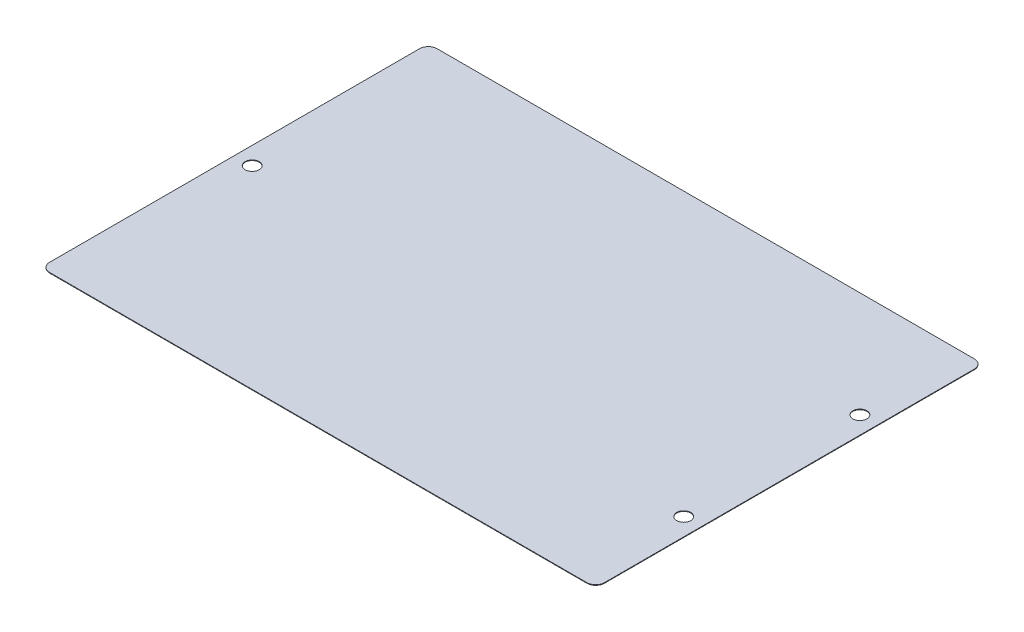
ISO-10303-21;
HEADER;
FILE_DESCRIPTION(('STEP AP214'),'2;1');
FILE_NAME('part.step','',(''),(''),'','','');
FILE_SCHEMA(('AUTOMOTIVE_DESIGN { 1 0 10303 214 1 1 1 1 }'));
ENDSEC;
DATA;
#1=APPLICATION_CONTEXT('core data for automotive mechanical design processes');
#2=APPLICATION_PROTOCOL_DEFINITION('international standard','automotive_design',2000,#1);
#3=PRODUCT_CONTEXT('',#1,'mechanical');
#4=PRODUCT('Part','Part','',(#3));
#5=PRODUCT_RELATED_PRODUCT_CATEGORY('part','',(#4));
#6=PRODUCT_DEFINITION_FORMATION('','',#4);
#7=PRODUCT_DEFINITION_CONTEXT('part definition',#1,'design');
#8=PRODUCT_DEFINITION('design','',#6,#7);
#9=PRODUCT_DEFINITION_SHAPE('','',#8);
#10=(LENGTH_UNIT() NAMED_UNIT(*) SI_UNIT(.MILLI.,.METRE.));
#11=(NAMED_UNIT(*) PLANE_ANGLE_UNIT() SI_UNIT($,.RADIAN.));
#12=(NAMED_UNIT(*) SI_UNIT($,.STERADIAN.) SOLID_ANGLE_UNIT());
#13=UNCERTAINTY_MEASURE_WITH_UNIT(LENGTH_MEASURE(1.E-05),#10,'distance_accuracy_value','');
#14=(GEOMETRIC_REPRESENTATION_CONTEXT(3) GLOBAL_UNCERTAINTY_ASSIGNED_CONTEXT((#13)) GLOBAL_UNIT_ASSIGNED_CONTEXT((#10,
#11,#12)) REPRESENTATION_CONTEXT('',''));
#15=CARTESIAN_POINT('',(0.,0.,0.));
#16=DIRECTION('',(0.,0.,1.));
#17=DIRECTION('',(1.,0.,0.));
#18=AXIS2_PLACEMENT_3D('',#15,#16,#17);
#19=CARTESIAN_POINT('',(0.,0.2,0.));
#20=DIRECTION('',(0.,1.,0.));
#21=DIRECTION('',(0.,0.,1.));
#22=AXIS2_PLACEMENT_3D('',#19,#20,#21);
#23=PLANE('',#22);
#24=CARTESIAN_POINT('',(183.,0.2,-36.));
#25=DIRECTION('',(0.,1.,0.));
#26=DIRECTION('',(0.,0.,1.));
#27=AXIS2_PLACEMENT_3D('',#24,#25,#26);
#28=CIRCLE('',#27,2.4);
#29=CARTESIAN_POINT('',(183.,0.2,-33.6));
#30=VERTEX_POINT('',#29);
#31=EDGE_CURVE('E180',#30,#30,#28,.T.);
#32=ORIENTED_EDGE('',*,*,#31,.F.);
#33=EDGE_LOOP('',(#32));
#34=FACE_BOUND('',#33,.T.);
#35=DIRECTION('',(-1.,0.,0.));
#36=VECTOR('',#35,1.);
#37=CARTESIAN_POINT('',(0.,0.2,-132.));
#38=LINE('',#37,#36);
#39=CARTESIAN_POINT('',(186.,0.2,-132.));
#40=VERTEX_POINT('',#39);
#41=CARTESIAN_POINT('',(3.,0.2,-132.));
#42=VERTEX_POINT('',#41);
#43=EDGE_CURVE('E135',#40,#42,#38,.T.);
#44=ORIENTED_EDGE('',*,*,#43,.T.);
#45=CARTESIAN_POINT('',(3.,0.2,-129.));
#46=DIRECTION('',(0.,1.,0.));
#47=DIRECTION('',(0.,0.,1.));
#48=AXIS2_PLACEMENT_3D('',#45,#46,#47);
#49=CIRCLE('',#48,3.);
#50=CARTESIAN_POINT('',(0.,0.2,-129.));
#51=VERTEX_POINT('',#50);
#52=EDGE_CURVE('E154',#42,#51,#49,.T.);
#53=ORIENTED_EDGE('',*,*,#52,.T.);
#54=DIRECTION('',(0.,0.,1.));
#55=VECTOR('',#54,1.);
#56=CARTESIAN_POINT('',(0.,0.2,-132.));
#57=LINE('',#56,#55);
#58=CARTESIAN_POINT('',(0.,0.2,-3.));
#59=VERTEX_POINT('',#58);
#60=EDGE_CURVE('E118',#51,#59,#57,.T.);
#61=ORIENTED_EDGE('',*,*,#60,.T.);
#62=CARTESIAN_POINT('',(3.,0.2,-3.));
#63=DIRECTION('',(0.,1.,0.));
#64=DIRECTION('',(0.,0.,1.));
#65=AXIS2_PLACEMENT_3D('',#62,#63,#64);
#66=CIRCLE('',#65,3.);
#67=CARTESIAN_POINT('',(3.,0.2,0.));
#68=VERTEX_POINT('',#67);
#69=EDGE_CURVE('E152',#59,#68,#66,.T.);
#70=ORIENTED_EDGE('',*,*,#69,.T.);
#71=DIRECTION('',(1.,0.,0.));
#72=VECTOR('',#71,1.);
#73=CARTESIAN_POINT('',(0.,0.2,0.));
#74=LINE('',#73,#72);
#75=CARTESIAN_POINT('',(186.,0.2,0.));
#76=VERTEX_POINT('',#75);
#77=EDGE_CURVE('E165',#68,#76,#74,.T.);
#78=ORIENTED_EDGE('',*,*,#77,.T.);
#79=CARTESIAN_POINT('',(186.,0.2,-3.));
#80=DIRECTION('',(0.,1.,0.));
#81=DIRECTION('',(0.,0.,1.));
#82=AXIS2_PLACEMENT_3D('',#79,#80,#81);
#83=CIRCLE('',#82,3.);
#84=CARTESIAN_POINT('',(189.,0.2,-3.));
#85=VERTEX_POINT('',#84);
#86=EDGE_CURVE('E53',#76,#85,#83,.T.);
#87=ORIENTED_EDGE('',*,*,#86,.T.);
#88=DIRECTION('',(0.,0.,-1.));
#89=VECTOR('',#88,1.);
#90=CARTESIAN_POINT('',(189.,0.2,-132.));
#91=LINE('',#90,#89);
#92=CARTESIAN_POINT('',(189.,0.2,-129.));
#93=VERTEX_POINT('',#92);
#94=EDGE_CURVE('E173',#85,#93,#91,.T.);
#95=ORIENTED_EDGE('',*,*,#94,.T.);
#96=CARTESIAN_POINT('',(186.,0.2,-129.));
#97=DIRECTION('',(0.,1.,0.));
#98=DIRECTION('',(0.,0.,1.));
#99=AXIS2_PLACEMENT_3D('',#96,#97,#98);
#100=CIRCLE('',#99,3.);
#101=EDGE_CURVE('E149',#93,#40,#100,.T.);
#102=ORIENTED_EDGE('',*,*,#101,.T.);
#103=EDGE_LOOP('',(#44,#53,#61,#70,#78,#87,#95,#102));
#104=FACE_BOUND('',#103,.T.);
#105=CARTESIAN_POINT('',(6.00000000000001,0.2,-66.));
#106=DIRECTION('',(0.,1.,0.));
#107=DIRECTION('',(0.,0.,1.));
#108=AXIS2_PLACEMENT_3D('',#105,#106,#107);
#109=CIRCLE('',#108,2.4);
#110=CARTESIAN_POINT('',(6.00000000000001,0.2,-63.6));
#111=VERTEX_POINT('',#110);
#112=EDGE_CURVE('E126',#111,#111,#109,.T.);
#113=ORIENTED_EDGE('',*,*,#112,.F.);
#114=EDGE_LOOP('',(#113));
#115=FACE_BOUND('',#114,.T.);
#116=CARTESIAN_POINT('',(183.,0.2,-96.));
#117=DIRECTION('',(0.,1.,0.));
#118=DIRECTION('',(0.,0.,1.));
#119=AXIS2_PLACEMENT_3D('',#116,#117,#118);
#120=CIRCLE('',#119,2.4);
#121=CARTESIAN_POINT('',(183.,0.2,-93.6));
#122=VERTEX_POINT('',#121);
#123=EDGE_CURVE('E185',#122,#122,#120,.T.);
#124=ORIENTED_EDGE('',*,*,#123,.F.);
#125=EDGE_LOOP('',(#124));
#126=FACE_BOUND('',#125,.T.);
#127=ADVANCED_FACE('F32',(#34,#104,#115,#126),#23,.T.);
#128=CARTESIAN_POINT('',(0.,0.,0.));
#129=DIRECTION('',(0.,1.,0.));
#130=DIRECTION('',(0.,0.,1.));
#131=AXIS2_PLACEMENT_3D('',#128,#129,#130);
#132=PLANE('',#131);
#133=CARTESIAN_POINT('',(183.,0.,-36.));
#134=DIRECTION('',(0.,1.,0.));
#135=DIRECTION('',(0.,0.,1.));
#136=AXIS2_PLACEMENT_3D('',#133,#134,#135);
#137=CIRCLE('',#136,2.4);
#138=CARTESIAN_POINT('',(183.,0.,-33.6));
#139=VERTEX_POINT('',#138);
#140=EDGE_CURVE('E182',#139,#139,#137,.T.);
#141=ORIENTED_EDGE('',*,*,#140,.T.);
#142=EDGE_LOOP('',(#141));
#143=FACE_BOUND('',#142,.T.);
#144=DIRECTION('',(0.,0.,1.));
#145=VECTOR('',#144,1.);
#146=CARTESIAN_POINT('',(0.,0.,-132.));
#147=LINE('',#146,#145);
#148=CARTESIAN_POINT('',(0.,0.,-129.));
#149=VERTEX_POINT('',#148);
#150=CARTESIAN_POINT('',(0.,0.,-3.));
#151=VERTEX_POINT('',#150);
#152=EDGE_CURVE('E115',#149,#151,#147,.T.);
#153=ORIENTED_EDGE('',*,*,#152,.F.);
#154=CARTESIAN_POINT('',(3.,0.,-129.));
#155=DIRECTION('',(0.,1.,0.));
#156=DIRECTION('',(0.,0.,1.));
#157=AXIS2_PLACEMENT_3D('',#154,#155,#156);
#158=CIRCLE('',#157,3.);
#159=CARTESIAN_POINT('',(3.,0.,-132.));
#160=VERTEX_POINT('',#159);
#161=EDGE_CURVE('E98',#149,#160,#158,.F.);
#162=ORIENTED_EDGE('',*,*,#161,.T.);
#163=DIRECTION('',(-1.,0.,0.));
#164=VECTOR('',#163,1.);
#165=CARTESIAN_POINT('',(0.,0.,-132.));
#166=LINE('',#165,#164);
#167=CARTESIAN_POINT('',(186.,0.,-132.));
#168=VERTEX_POINT('',#167);
#169=EDGE_CURVE('E139',#168,#160,#166,.T.);
#170=ORIENTED_EDGE('',*,*,#169,.F.);
#171=CARTESIAN_POINT('',(186.,0.,-129.));
#172=DIRECTION('',(0.,1.,0.));
#173=DIRECTION('',(0.,0.,1.));
#174=AXIS2_PLACEMENT_3D('',#171,#172,#173);
#175=CIRCLE('',#174,3.);
#176=CARTESIAN_POINT('',(189.,0.,-129.));
#177=VERTEX_POINT('',#176);
#178=EDGE_CURVE('E119',#168,#177,#175,.F.);
#179=ORIENTED_EDGE('',*,*,#178,.T.);
#180=DIRECTION('',(0.,0.,-1.));
#181=VECTOR('',#180,1.);
#182=CARTESIAN_POINT('',(189.,0.,-132.));
#183=LINE('',#182,#181);
#184=CARTESIAN_POINT('',(189.,0.,-3.));
#185=VERTEX_POINT('',#184);
#186=EDGE_CURVE('E129',#185,#177,#183,.T.);
#187=ORIENTED_EDGE('',*,*,#186,.F.);
#188=CARTESIAN_POINT('',(186.,0.,-3.));
#189=DIRECTION('',(0.,1.,0.));
#190=DIRECTION('',(0.,0.,1.));
#191=AXIS2_PLACEMENT_3D('',#188,#189,#190);
#192=CIRCLE('',#191,3.);
#193=CARTESIAN_POINT('',(186.,0.,0.));
#194=VERTEX_POINT('',#193);
#195=EDGE_CURVE('E143',#185,#194,#192,.F.);
#196=ORIENTED_EDGE('',*,*,#195,.T.);
#197=DIRECTION('',(1.,0.,0.));
#198=VECTOR('',#197,1.);
#199=CARTESIAN_POINT('',(0.,0.,0.));
#200=LINE('',#199,#198);
#201=CARTESIAN_POINT('',(3.,0.,0.));
#202=VERTEX_POINT('',#201);
#203=EDGE_CURVE('E125',#202,#194,#200,.T.);
#204=ORIENTED_EDGE('',*,*,#203,.F.);
#205=CARTESIAN_POINT('',(3.,0.,-3.));
#206=DIRECTION('',(0.,1.,0.));
#207=DIRECTION('',(0.,0.,1.));
#208=AXIS2_PLACEMENT_3D('',#205,#206,#207);
#209=CIRCLE('',#208,3.);
#210=EDGE_CURVE('E109',#202,#151,#209,.F.);
#211=ORIENTED_EDGE('',*,*,#210,.T.);
#212=EDGE_LOOP('',(#153,#162,#170,#179,#187,#196,#204,#211));
#213=FACE_BOUND('',#212,.T.);
#214=CARTESIAN_POINT('',(6.00000000000001,0.,-66.));
#215=DIRECTION('',(0.,1.,0.));
#216=DIRECTION('',(0.,0.,1.));
#217=AXIS2_PLACEMENT_3D('',#214,#215,#216);
#218=CIRCLE('',#217,2.4);
#219=CARTESIAN_POINT('',(6.00000000000001,0.,-63.6));
#220=VERTEX_POINT('',#219);
#221=EDGE_CURVE('E132',#220,#220,#218,.T.);
#222=ORIENTED_EDGE('',*,*,#221,.T.);
#223=EDGE_LOOP('',(#222));
#224=FACE_BOUND('',#223,.T.);
#225=CARTESIAN_POINT('',(183.,0.,-96.));
#226=DIRECTION('',(0.,1.,0.));
#227=DIRECTION('',(0.,0.,1.));
#228=AXIS2_PLACEMENT_3D('',#225,#226,#227);
#229=CIRCLE('',#228,2.4);
#230=CARTESIAN_POINT('',(183.,0.,-93.6));
#231=VERTEX_POINT('',#230);
#232=EDGE_CURVE('E188',#231,#231,#229,.T.);
#233=ORIENTED_EDGE('',*,*,#232,.T.);
#234=EDGE_LOOP('',(#233));
#235=FACE_BOUND('',#234,.T.);
#236=ADVANCED_FACE('F122',(#143,#213,#224,#235),#132,.F.);
#237=CARTESIAN_POINT('',(0.,0.2,-132.));
#238=DIRECTION('',(1.,0.,0.));
#239=DIRECTION('',(0.,0.,-1.));
#240=AXIS2_PLACEMENT_3D('',#237,#238,#239);
#241=PLANE('',#240);
#242=ORIENTED_EDGE('',*,*,#60,.F.);
#243=DIRECTION('',(0.,-1.,0.));
#244=VECTOR('',#243,1.);
#245=CARTESIAN_POINT('',(0.,0.2,-129.));
#246=LINE('',#245,#244);
#247=EDGE_CURVE('E102',#51,#149,#246,.T.);
#248=ORIENTED_EDGE('',*,*,#247,.T.);
#249=ORIENTED_EDGE('',*,*,#152,.T.);
#250=DIRECTION('',(0.,-1.,0.));
#251=VECTOR('',#250,1.);
#252=CARTESIAN_POINT('',(0.,0.2,-3.));
#253=LINE('',#252,#251);
#254=EDGE_CURVE('E120',#151,#59,#253,.F.);
#255=ORIENTED_EDGE('',*,*,#254,.T.);
#256=EDGE_LOOP('',(#242,#248,#249,#255));
#257=FACE_BOUND('',#256,.T.);
#258=ADVANCED_FACE('F114',(#257),#241,.F.);
#259=CARTESIAN_POINT('',(0.,0.2,0.));
#260=DIRECTION('',(0.,0.,-1.));
#261=DIRECTION('',(-1.,0.,0.));
#262=AXIS2_PLACEMENT_3D('',#259,#260,#261);
#263=PLANE('',#262);
#264=ORIENTED_EDGE('',*,*,#77,.F.);
#265=DIRECTION('',(0.,-1.,0.));
#266=VECTOR('',#265,1.);
#267=CARTESIAN_POINT('',(3.,0.2,0.));
#268=LINE('',#267,#266);
#269=EDGE_CURVE('E158',#68,#202,#268,.T.);
#270=ORIENTED_EDGE('',*,*,#269,.T.);
#271=ORIENTED_EDGE('',*,*,#203,.T.);
#272=DIRECTION('',(0.,-1.,0.));
#273=VECTOR('',#272,1.);
#274=CARTESIAN_POINT('',(186.,0.2,0.));
#275=LINE('',#274,#273);
#276=EDGE_CURVE('E156',#194,#76,#275,.F.);
#277=ORIENTED_EDGE('',*,*,#276,.T.);
#278=EDGE_LOOP('',(#264,#270,#271,#277));
#279=FACE_BOUND('',#278,.T.);
#280=ADVANCED_FACE('F163',(#279),#263,.F.);
#281=CARTESIAN_POINT('',(189.,0.2,-132.));
#282=DIRECTION('',(-1.,0.,0.));
#283=DIRECTION('',(0.,0.,1.));
#284=AXIS2_PLACEMENT_3D('',#281,#282,#283);
#285=PLANE('',#284);
#286=ORIENTED_EDGE('',*,*,#94,.F.);
#287=DIRECTION('',(0.,-1.,0.));
#288=VECTOR('',#287,1.);
#289=CARTESIAN_POINT('',(189.,0.2,-3.));
#290=LINE('',#289,#288);
#291=EDGE_CURVE('E11',#85,#185,#290,.T.);
#292=ORIENTED_EDGE('',*,*,#291,.T.);
#293=ORIENTED_EDGE('',*,*,#186,.T.);
#294=DIRECTION('',(0.,-1.,0.));
#295=VECTOR('',#294,1.);
#296=CARTESIAN_POINT('',(189.,0.2,-129.));
#297=LINE('',#296,#295);
#298=EDGE_CURVE('E40',#177,#93,#297,.F.);
#299=ORIENTED_EDGE('',*,*,#298,.T.);
#300=EDGE_LOOP('',(#286,#292,#293,#299));
#301=FACE_BOUND('',#300,.T.);
#302=ADVANCED_FACE('F172',(#301),#285,.F.);
#303=CARTESIAN_POINT('',(0.,0.2,-132.));
#304=DIRECTION('',(0.,0.,1.));
#305=DIRECTION('',(1.,0.,0.));
#306=AXIS2_PLACEMENT_3D('',#303,#304,#305);
#307=PLANE('',#306);
#308=ORIENTED_EDGE('',*,*,#169,.T.);
#309=DIRECTION('',(0.,-1.,0.));
#310=VECTOR('',#309,1.);
#311=CARTESIAN_POINT('',(3.,0.2,-132.));
#312=LINE('',#311,#310);
#313=EDGE_CURVE('E103',#160,#42,#312,.F.);
#314=ORIENTED_EDGE('',*,*,#313,.T.);
#315=ORIENTED_EDGE('',*,*,#43,.F.);
#316=DIRECTION('',(0.,-1.,0.));
#317=VECTOR('',#316,1.);
#318=CARTESIAN_POINT('',(186.,0.2,-132.));
#319=LINE('',#318,#317);
#320=EDGE_CURVE('E108',#40,#168,#319,.T.);
#321=ORIENTED_EDGE('',*,*,#320,.T.);
#322=EDGE_LOOP('',(#308,#314,#315,#321));
#323=FACE_BOUND('',#322,.T.);
#324=ADVANCED_FACE('F210',(#323),#307,.F.);
#325=CARTESIAN_POINT('',(6.00000000000001,0.2,-66.));
#326=DIRECTION('',(0.,-1.,0.));
#327=DIRECTION('',(0.,0.,-1.));
#328=AXIS2_PLACEMENT_3D('',#325,#326,#327);
#329=CYLINDRICAL_SURFACE('',#328,2.4);
#330=ORIENTED_EDGE('',*,*,#112,.T.);
#331=EDGE_LOOP('',(#330));
#332=FACE_BOUND('',#331,.T.);
#333=ORIENTED_EDGE('',*,*,#221,.F.);
#334=EDGE_LOOP('',(#333));
#335=FACE_BOUND('',#334,.T.);
#336=ADVANCED_FACE('F207',(#332,#335),#329,.F.);
#337=CARTESIAN_POINT('',(183.,0.2,-36.));
#338=DIRECTION('',(0.,-1.,0.));
#339=DIRECTION('',(0.,0.,-1.));
#340=AXIS2_PLACEMENT_3D('',#337,#338,#339);
#341=CYLINDRICAL_SURFACE('',#340,2.4);
#342=ORIENTED_EDGE('',*,*,#31,.T.);
#343=EDGE_LOOP('',(#342));
#344=FACE_BOUND('',#343,.T.);
#345=ORIENTED_EDGE('',*,*,#140,.F.);
#346=EDGE_LOOP('',(#345));
#347=FACE_BOUND('',#346,.T.);
#348=ADVANCED_FACE('F238',(#344,#347),#341,.F.);
#349=CARTESIAN_POINT('',(183.,0.2,-96.));
#350=DIRECTION('',(0.,-1.,0.));
#351=DIRECTION('',(0.,0.,-1.));
#352=AXIS2_PLACEMENT_3D('',#349,#350,#351);
#353=CYLINDRICAL_SURFACE('',#352,2.4);
#354=ORIENTED_EDGE('',*,*,#123,.T.);
#355=EDGE_LOOP('',(#354));
#356=FACE_BOUND('',#355,.T.);
#357=ORIENTED_EDGE('',*,*,#232,.F.);
#358=EDGE_LOOP('',(#357));
#359=FACE_BOUND('',#358,.T.);
#360=ADVANCED_FACE('F194',(#356,#359),#353,.F.);
#361=CARTESIAN_POINT('',(3.,0.2,-129.));
#362=DIRECTION('',(0.,-1.,0.));
#363=DIRECTION('',(0.,0.,-1.));
#364=AXIS2_PLACEMENT_3D('',#361,#362,#363);
#365=CYLINDRICAL_SURFACE('',#364,3.);
#366=ORIENTED_EDGE('',*,*,#52,.F.);
#367=ORIENTED_EDGE('',*,*,#313,.F.);
#368=ORIENTED_EDGE('',*,*,#161,.F.);
#369=ORIENTED_EDGE('',*,*,#247,.F.);
#370=EDGE_LOOP('',(#366,#367,#368,#369));
#371=FACE_BOUND('',#370,.T.);
#372=ADVANCED_FACE('F101',(#371),#365,.T.);
#373=CARTESIAN_POINT('',(3.,0.2,-3.));
#374=DIRECTION('',(0.,-1.,0.));
#375=DIRECTION('',(0.,0.,-1.));
#376=AXIS2_PLACEMENT_3D('',#373,#374,#375);
#377=CYLINDRICAL_SURFACE('',#376,3.);
#378=ORIENTED_EDGE('',*,*,#69,.F.);
#379=ORIENTED_EDGE('',*,*,#254,.F.);
#380=ORIENTED_EDGE('',*,*,#210,.F.);
#381=ORIENTED_EDGE('',*,*,#269,.F.);
#382=EDGE_LOOP('',(#378,#379,#380,#381));
#383=FACE_BOUND('',#382,.T.);
#384=ADVANCED_FACE('F222',(#383),#377,.T.);
#385=CARTESIAN_POINT('',(186.,0.2,-3.));
#386=DIRECTION('',(0.,-1.,0.));
#387=DIRECTION('',(0.,0.,-1.));
#388=AXIS2_PLACEMENT_3D('',#385,#386,#387);
#389=CYLINDRICAL_SURFACE('',#388,3.);
#390=ORIENTED_EDGE('',*,*,#86,.F.);
#391=ORIENTED_EDGE('',*,*,#276,.F.);
#392=ORIENTED_EDGE('',*,*,#195,.F.);
#393=ORIENTED_EDGE('',*,*,#291,.F.);
#394=EDGE_LOOP('',(#390,#391,#392,#393));
#395=FACE_BOUND('',#394,.T.);
#396=ADVANCED_FACE('F171',(#395),#389,.T.);
#397=CARTESIAN_POINT('',(186.,0.2,-129.));
#398=DIRECTION('',(0.,-1.,0.));
#399=DIRECTION('',(0.,0.,-1.));
#400=AXIS2_PLACEMENT_3D('',#397,#398,#399);
#401=CYLINDRICAL_SURFACE('',#400,3.);
#402=ORIENTED_EDGE('',*,*,#101,.F.);
#403=ORIENTED_EDGE('',*,*,#298,.F.);
#404=ORIENTED_EDGE('',*,*,#178,.F.);
#405=ORIENTED_EDGE('',*,*,#320,.F.);
#406=EDGE_LOOP('',(#402,#403,#404,#405));
#407=FACE_BOUND('',#406,.T.);
#408=ADVANCED_FACE('F34',(#407),#401,.T.);
#409=CLOSED_SHELL('',(#127,#236,#258,#280,#302,#324,#336,#348,#360,#372,#384,#396,#408));
#410=MANIFOLD_SOLID_BREP('B2',#409);
#411=ADVANCED_BREP_SHAPE_REPRESENTATION('',(#18,#410),#14);
#412=SHAPE_DEFINITION_REPRESENTATION(#9,#411);
ENDSEC;
END-ISO-10303-21;
